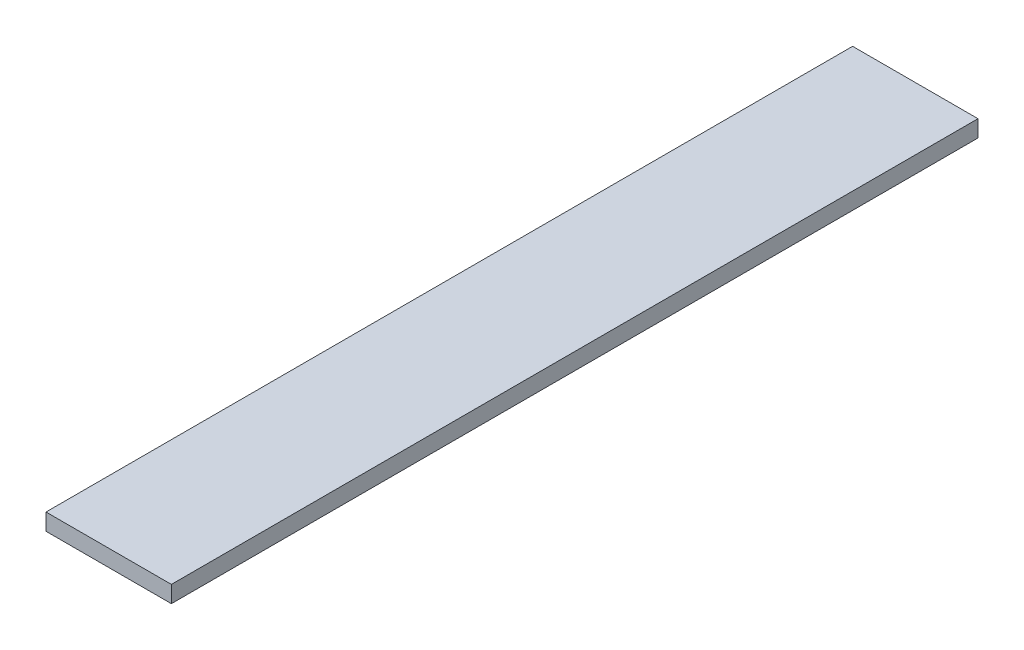
ISO-10303-21;
HEADER;
FILE_DESCRIPTION(('STEP AP214'),'2;1');
FILE_NAME('part.step','',(''),(''),'','','');
FILE_SCHEMA(('AUTOMOTIVE_DESIGN { 1 0 10303 214 1 1 1 1 }'));
ENDSEC;
DATA;
#1=APPLICATION_CONTEXT('core data for automotive mechanical design processes');
#2=APPLICATION_PROTOCOL_DEFINITION('international standard','automotive_design',2000,#1);
#3=PRODUCT_CONTEXT('',#1,'mechanical');
#4=PRODUCT('Part','Part','',(#3));
#5=PRODUCT_RELATED_PRODUCT_CATEGORY('part','',(#4));
#6=PRODUCT_DEFINITION_FORMATION('','',#4);
#7=PRODUCT_DEFINITION_CONTEXT('part definition',#1,'design');
#8=PRODUCT_DEFINITION('design','',#6,#7);
#9=PRODUCT_DEFINITION_SHAPE('','',#8);
#10=(LENGTH_UNIT() NAMED_UNIT(*) SI_UNIT(.MILLI.,.METRE.));
#11=(NAMED_UNIT(*) PLANE_ANGLE_UNIT() SI_UNIT($,.RADIAN.));
#12=(NAMED_UNIT(*) SI_UNIT($,.STERADIAN.) SOLID_ANGLE_UNIT());
#13=UNCERTAINTY_MEASURE_WITH_UNIT(LENGTH_MEASURE(1.E-05),#10,'distance_accuracy_value','');
#14=(GEOMETRIC_REPRESENTATION_CONTEXT(3) GLOBAL_UNCERTAINTY_ASSIGNED_CONTEXT((#13)) GLOBAL_UNIT_ASSIGNED_CONTEXT((#10,
#11,#12)) REPRESENTATION_CONTEXT('',''));
#15=CARTESIAN_POINT('',(0.,0.,0.));
#16=DIRECTION('',(0.,0.,1.));
#17=DIRECTION('',(1.,0.,0.));
#18=AXIS2_PLACEMENT_3D('',#15,#16,#17);
#19=CARTESIAN_POINT('',(-96.225965319519,0.,1930.));
#20=DIRECTION('',(0.,1.,0.));
#21=DIRECTION('',(0.,0.,1.));
#22=AXIS2_PLACEMENT_3D('',#19,#20,#21);
#23=PLANE('',#22);
#24=DIRECTION('',(1.,0.,0.));
#25=VECTOR('',#24,1.);
#26=CARTESIAN_POINT('',(-96.225965319519,0.,0.));
#27=LINE('',#26,#25);
#28=CARTESIAN_POINT('',(-96.225965319519,0.,0.));
#29=VERTEX_POINT('',#28);
#30=CARTESIAN_POINT('',(203.774034680481,0.,0.));
#31=VERTEX_POINT('',#30);
#32=EDGE_CURVE('E95',#29,#31,#27,.T.);
#33=ORIENTED_EDGE('',*,*,#32,.T.);
#34=DIRECTION('',(0.,0.,-1.));
#35=VECTOR('',#34,1.);
#36=CARTESIAN_POINT('',(203.774034680481,0.,1930.));
#37=LINE('',#36,#35);
#38=CARTESIAN_POINT('',(203.774034680481,0.,1930.));
#39=VERTEX_POINT('',#38);
#40=EDGE_CURVE('E11',#39,#31,#37,.T.);
#41=ORIENTED_EDGE('',*,*,#40,.F.);
#42=DIRECTION('',(1.,0.,0.));
#43=VECTOR('',#42,1.);
#44=CARTESIAN_POINT('',(-96.225965319519,0.,1930.));
#45=LINE('',#44,#43);
#46=CARTESIAN_POINT('',(-96.225965319519,0.,1930.));
#47=VERTEX_POINT('',#46);
#48=EDGE_CURVE('E83',#47,#39,#45,.T.);
#49=ORIENTED_EDGE('',*,*,#48,.F.);
#50=DIRECTION('',(0.,0.,-1.));
#51=VECTOR('',#50,1.);
#52=CARTESIAN_POINT('',(-96.225965319519,0.,1930.));
#53=LINE('',#52,#51);
#54=EDGE_CURVE('E91',#47,#29,#53,.T.);
#55=ORIENTED_EDGE('',*,*,#54,.T.);
#56=EDGE_LOOP('',(#33,#41,#49,#55));
#57=FACE_BOUND('',#56,.T.);
#58=ADVANCED_FACE('F32',(#57),#23,.F.);
#59=CARTESIAN_POINT('',(203.774034680481,0.,1930.));
#60=DIRECTION('',(-1.,0.,0.));
#61=DIRECTION('',(0.,0.,1.));
#62=AXIS2_PLACEMENT_3D('',#59,#60,#61);
#63=PLANE('',#62);
#64=DIRECTION('',(0.,1.,0.));
#65=VECTOR('',#64,1.);
#66=CARTESIAN_POINT('',(203.774034680481,0.,0.));
#67=LINE('',#66,#65);
#68=CARTESIAN_POINT('',(203.774034680481,40.,0.));
#69=VERTEX_POINT('',#68);
#70=EDGE_CURVE('E87',#31,#69,#67,.T.);
#71=ORIENTED_EDGE('',*,*,#70,.T.);
#72=DIRECTION('',(0.,0.,-1.));
#73=VECTOR('',#72,1.);
#74=CARTESIAN_POINT('',(203.774034680481,40.,1930.));
#75=LINE('',#74,#73);
#76=CARTESIAN_POINT('',(203.774034680481,40.,1930.));
#77=VERTEX_POINT('',#76);
#78=EDGE_CURVE('E40',#77,#69,#75,.T.);
#79=ORIENTED_EDGE('',*,*,#78,.F.);
#80=DIRECTION('',(0.,1.,0.));
#81=VECTOR('',#80,1.);
#82=CARTESIAN_POINT('',(203.774034680481,0.,1930.));
#83=LINE('',#82,#81);
#84=EDGE_CURVE('E78',#39,#77,#83,.T.);
#85=ORIENTED_EDGE('',*,*,#84,.F.);
#86=ORIENTED_EDGE('',*,*,#40,.T.);
#87=EDGE_LOOP('',(#71,#79,#85,#86));
#88=FACE_BOUND('',#87,.T.);
#89=ADVANCED_FACE('F86',(#88),#63,.F.);
#90=CARTESIAN_POINT('',(-96.225965319519,40.,1930.));
#91=DIRECTION('',(0.,-1.,0.));
#92=DIRECTION('',(0.,0.,-1.));
#93=AXIS2_PLACEMENT_3D('',#90,#91,#92);
#94=PLANE('',#93);
#95=DIRECTION('',(-1.,0.,0.));
#96=VECTOR('',#95,1.);
#97=CARTESIAN_POINT('',(-96.225965319519,40.,0.));
#98=LINE('',#97,#96);
#99=CARTESIAN_POINT('',(-96.225965319519,40.,0.));
#100=VERTEX_POINT('',#99);
#101=EDGE_CURVE('E65',#69,#100,#98,.T.);
#102=ORIENTED_EDGE('',*,*,#101,.T.);
#103=DIRECTION('',(0.,0.,-1.));
#104=VECTOR('',#103,1.);
#105=CARTESIAN_POINT('',(-96.225965319519,40.,1930.));
#106=LINE('',#105,#104);
#107=CARTESIAN_POINT('',(-96.225965319519,40.,1930.));
#108=VERTEX_POINT('',#107);
#109=EDGE_CURVE('E88',#108,#100,#106,.T.);
#110=ORIENTED_EDGE('',*,*,#109,.F.);
#111=DIRECTION('',(-1.,0.,0.));
#112=VECTOR('',#111,1.);
#113=CARTESIAN_POINT('',(-96.225965319519,40.,1930.));
#114=LINE('',#113,#112);
#115=EDGE_CURVE('E81',#77,#108,#114,.T.);
#116=ORIENTED_EDGE('',*,*,#115,.F.);
#117=ORIENTED_EDGE('',*,*,#78,.T.);
#118=EDGE_LOOP('',(#102,#110,#116,#117));
#119=FACE_BOUND('',#118,.T.);
#120=ADVANCED_FACE('F89',(#119),#94,.F.);
#121=CARTESIAN_POINT('',(-96.225965319519,0.,1930.));
#122=DIRECTION('',(1.,0.,0.));
#123=DIRECTION('',(0.,0.,-1.));
#124=AXIS2_PLACEMENT_3D('',#121,#122,#123);
#125=PLANE('',#124);
#126=DIRECTION('',(0.,-1.,0.));
#127=VECTOR('',#126,1.);
#128=CARTESIAN_POINT('',(-96.225965319519,0.,0.));
#129=LINE('',#128,#127);
#130=EDGE_CURVE('E71',#100,#29,#129,.T.);
#131=ORIENTED_EDGE('',*,*,#130,.T.);
#132=ORIENTED_EDGE('',*,*,#54,.F.);
#133=DIRECTION('',(0.,-1.,0.));
#134=VECTOR('',#133,1.);
#135=CARTESIAN_POINT('',(-96.225965319519,0.,1930.));
#136=LINE('',#135,#134);
#137=EDGE_CURVE('E48',#108,#47,#136,.T.);
#138=ORIENTED_EDGE('',*,*,#137,.F.);
#139=ORIENTED_EDGE('',*,*,#109,.T.);
#140=EDGE_LOOP('',(#131,#132,#138,#139));
#141=FACE_BOUND('',#140,.T.);
#142=ADVANCED_FACE('F102',(#141),#125,.F.);
#143=CARTESIAN_POINT('',(203.774034680481,0.,1930.));
#144=DIRECTION('',(0.,0.,1.));
#145=DIRECTION('',(1.,0.,0.));
#146=AXIS2_PLACEMENT_3D('',#143,#144,#145);
#147=PLANE('',#146);
#148=ORIENTED_EDGE('',*,*,#48,.T.);
#149=ORIENTED_EDGE('',*,*,#84,.T.);
#150=ORIENTED_EDGE('',*,*,#115,.T.);
#151=ORIENTED_EDGE('',*,*,#137,.T.);
#152=EDGE_LOOP('',(#148,#149,#150,#151));
#153=FACE_BOUND('',#152,.T.);
#154=ADVANCED_FACE('F79',(#153),#147,.T.);
#155=CARTESIAN_POINT('',(203.774034680481,0.,0.));
#156=DIRECTION('',(0.,0.,1.));
#157=DIRECTION('',(1.,0.,0.));
#158=AXIS2_PLACEMENT_3D('',#155,#156,#157);
#159=PLANE('',#158);
#160=ORIENTED_EDGE('',*,*,#32,.F.);
#161=ORIENTED_EDGE('',*,*,#130,.F.);
#162=ORIENTED_EDGE('',*,*,#101,.F.);
#163=ORIENTED_EDGE('',*,*,#70,.F.);
#164=EDGE_LOOP('',(#160,#161,#162,#163));
#165=FACE_BOUND('',#164,.T.);
#166=ADVANCED_FACE('F105',(#165),#159,.F.);
#167=CLOSED_SHELL('',(#58,#89,#120,#142,#154,#166));
#168=MANIFOLD_SOLID_BREP('B2',#167);
#169=ADVANCED_BREP_SHAPE_REPRESENTATION('',(#18,#168),#14);
#170=SHAPE_DEFINITION_REPRESENTATION(#9,#169);
ENDSEC;
END-ISO-10303-21;
